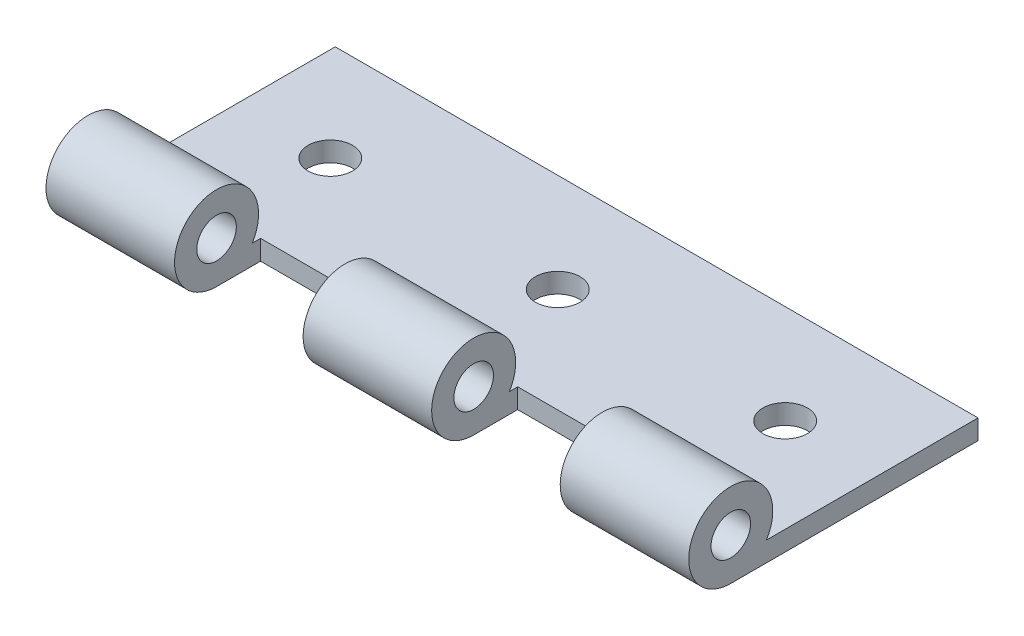
ISO-10303-21;
HEADER;
FILE_DESCRIPTION(('STEP AP214'),'2;1');
FILE_NAME('part.step','',(''),(''),'','','');
FILE_SCHEMA(('AUTOMOTIVE_DESIGN { 1 0 10303 214 1 1 1 1 }'));
ENDSEC;
DATA;
#1=APPLICATION_CONTEXT('core data for automotive mechanical design processes');
#2=APPLICATION_PROTOCOL_DEFINITION('international standard','automotive_design',2000,#1);
#3=PRODUCT_CONTEXT('',#1,'mechanical');
#4=PRODUCT('Part','Part','',(#3));
#5=PRODUCT_RELATED_PRODUCT_CATEGORY('part','',(#4));
#6=PRODUCT_DEFINITION_FORMATION('','',#4);
#7=PRODUCT_DEFINITION_CONTEXT('part definition',#1,'design');
#8=PRODUCT_DEFINITION('design','',#6,#7);
#9=PRODUCT_DEFINITION_SHAPE('','',#8);
#10=(LENGTH_UNIT() NAMED_UNIT(*) SI_UNIT(.MILLI.,.METRE.));
#11=(NAMED_UNIT(*) PLANE_ANGLE_UNIT() SI_UNIT($,.RADIAN.));
#12=(NAMED_UNIT(*) SI_UNIT($,.STERADIAN.) SOLID_ANGLE_UNIT());
#13=UNCERTAINTY_MEASURE_WITH_UNIT(LENGTH_MEASURE(1.E-05),#10,'distance_accuracy_value','');
#14=(GEOMETRIC_REPRESENTATION_CONTEXT(3) GLOBAL_UNCERTAINTY_ASSIGNED_CONTEXT((#13)) GLOBAL_UNIT_ASSIGNED_CONTEXT((#10,
#11,#12)) REPRESENTATION_CONTEXT('',''));
#15=CARTESIAN_POINT('',(0.,0.,0.));
#16=DIRECTION('',(0.,0.,1.));
#17=DIRECTION('',(1.,0.,0.));
#18=AXIS2_PLACEMENT_3D('',#15,#16,#17);
#19=CARTESIAN_POINT('',(23.,2.,0.));
#20=DIRECTION('',(0.,1.,0.));
#21=DIRECTION('',(0.,0.,1.));
#22=AXIS2_PLACEMENT_3D('',#19,#20,#21);
#23=CYLINDRICAL_SURFACE('',#22,2.25);
#24=CARTESIAN_POINT('',(23.,0.,0.));
#25=DIRECTION('',(0.,1.,0.));
#26=DIRECTION('',(0.,0.,1.));
#27=AXIS2_PLACEMENT_3D('',#24,#25,#26);
#28=CIRCLE('',#27,2.25);
#29=CARTESIAN_POINT('',(23.,0.,2.25));
#30=VERTEX_POINT('',#29);
#31=EDGE_CURVE('E225',#30,#30,#28,.T.);
#32=ORIENTED_EDGE('',*,*,#31,.F.);
#33=EDGE_LOOP('',(#32));
#34=FACE_BOUND('',#33,.T.);
#35=CARTESIAN_POINT('',(23.,2.,0.));
#36=DIRECTION('',(0.,1.,0.));
#37=DIRECTION('',(0.,0.,1.));
#38=AXIS2_PLACEMENT_3D('',#35,#36,#37);
#39=CIRCLE('',#38,2.25);
#40=CARTESIAN_POINT('',(23.,2.,2.25));
#41=VERTEX_POINT('',#40);
#42=EDGE_CURVE('E205',#41,#41,#39,.T.);
#43=ORIENTED_EDGE('',*,*,#42,.T.);
#44=EDGE_LOOP('',(#43));
#45=FACE_BOUND('',#44,.T.);
#46=ADVANCED_FACE('F17',(#34,#45),#23,.F.);
#47=CARTESIAN_POINT('',(46.,2.,0.));
#48=DIRECTION('',(0.,1.,0.));
#49=DIRECTION('',(0.,0.,1.));
#50=AXIS2_PLACEMENT_3D('',#47,#48,#49);
#51=CYLINDRICAL_SURFACE('',#50,2.25);
#52=CARTESIAN_POINT('',(46.,0.,0.));
#53=DIRECTION('',(0.,1.,0.));
#54=DIRECTION('',(0.,0.,1.));
#55=AXIS2_PLACEMENT_3D('',#52,#53,#54);
#56=CIRCLE('',#55,2.25);
#57=CARTESIAN_POINT('',(46.,0.,2.25));
#58=VERTEX_POINT('',#57);
#59=EDGE_CURVE('E333',#58,#58,#56,.T.);
#60=ORIENTED_EDGE('',*,*,#59,.F.);
#61=EDGE_LOOP('',(#60));
#62=FACE_BOUND('',#61,.T.);
#63=CARTESIAN_POINT('',(46.,2.,0.));
#64=DIRECTION('',(0.,1.,0.));
#65=DIRECTION('',(0.,0.,1.));
#66=AXIS2_PLACEMENT_3D('',#63,#64,#65);
#67=CIRCLE('',#66,2.25);
#68=CARTESIAN_POINT('',(46.,2.,2.25));
#69=VERTEX_POINT('',#68);
#70=EDGE_CURVE('E273',#69,#69,#67,.T.);
#71=ORIENTED_EDGE('',*,*,#70,.T.);
#72=EDGE_LOOP('',(#71));
#73=FACE_BOUND('',#72,.T.);
#74=ADVANCED_FACE('F19',(#62,#73),#51,.F.);
#75=CARTESIAN_POINT('',(0.,2.,0.));
#76=DIRECTION('',(0.,1.,0.));
#77=DIRECTION('',(0.,0.,1.));
#78=AXIS2_PLACEMENT_3D('',#75,#76,#77);
#79=CYLINDRICAL_SURFACE('',#78,2.25);
#80=CARTESIAN_POINT('',(0.,0.,0.));
#81=DIRECTION('',(0.,1.,0.));
#82=DIRECTION('',(0.,0.,1.));
#83=AXIS2_PLACEMENT_3D('',#80,#81,#82);
#84=CIRCLE('',#83,2.25);
#85=CARTESIAN_POINT('',(0.,0.,2.25));
#86=VERTEX_POINT('',#85);
#87=EDGE_CURVE('E336',#86,#86,#84,.T.);
#88=ORIENTED_EDGE('',*,*,#87,.F.);
#89=EDGE_LOOP('',(#88));
#90=FACE_BOUND('',#89,.T.);
#91=CARTESIAN_POINT('',(0.,2.,0.));
#92=DIRECTION('',(0.,1.,0.));
#93=DIRECTION('',(0.,0.,1.));
#94=AXIS2_PLACEMENT_3D('',#91,#92,#93);
#95=CIRCLE('',#94,2.25);
#96=CARTESIAN_POINT('',(0.,2.,2.25));
#97=VERTEX_POINT('',#96);
#98=EDGE_CURVE('E274',#97,#97,#95,.T.);
#99=ORIENTED_EDGE('',*,*,#98,.T.);
#100=EDGE_LOOP('',(#99));
#101=FACE_BOUND('',#100,.T.);
#102=ADVANCED_FACE('F572',(#90,#101),#79,.F.);
#103=CARTESIAN_POINT('',(29.5,8.5,10.55));
#104=DIRECTION('',(0.,0.,1.));
#105=DIRECTION('',(1.,0.,0.));
#106=AXIS2_PLACEMENT_3D('',#103,#104,#105);
#107=PLANE('',#106);
#108=DIRECTION('',(0.,-1.,0.));
#109=VECTOR('',#108,1.);
#110=CARTESIAN_POINT('',(29.5,8.5,10.55));
#111=LINE('',#110,#109);
#112=CARTESIAN_POINT('',(29.5,2.,10.55));
#113=VERTEX_POINT('',#112);
#114=CARTESIAN_POINT('',(29.5,0.,10.55));
#115=VERTEX_POINT('',#114);
#116=EDGE_CURVE('E11',#113,#115,#111,.T.);
#117=ORIENTED_EDGE('',*,*,#116,.T.);
#118=DIRECTION('',(-1.,0.,0.));
#119=VECTOR('',#118,1.);
#120=CARTESIAN_POINT('',(29.5,0.,10.55));
#121=LINE('',#120,#119);
#122=CARTESIAN_POINT('',(42.5,0.,10.55));
#123=VERTEX_POINT('',#122);
#124=EDGE_CURVE('E285',#123,#115,#121,.T.);
#125=ORIENTED_EDGE('',*,*,#124,.F.);
#126=DIRECTION('',(0.,-1.,0.));
#127=VECTOR('',#126,1.);
#128=CARTESIAN_POINT('',(42.5,8.5,10.55));
#129=LINE('',#128,#127);
#130=CARTESIAN_POINT('',(42.5,2.,10.55));
#131=VERTEX_POINT('',#130);
#132=EDGE_CURVE('E21',#131,#123,#129,.T.);
#133=ORIENTED_EDGE('',*,*,#132,.F.);
#134=DIRECTION('',(1.,0.,0.));
#135=VECTOR('',#134,1.);
#136=CARTESIAN_POINT('',(-9.5,2.,10.55));
#137=LINE('',#136,#135);
#138=EDGE_CURVE('E200',#113,#131,#137,.T.);
#139=ORIENTED_EDGE('',*,*,#138,.F.);
#140=EDGE_LOOP('',(#117,#125,#133,#139));
#141=FACE_BOUND('',#140,.T.);
#142=ADVANCED_FACE('F207',(#141),#107,.T.);
#143=CARTESIAN_POINT('',(29.5,8.5,19.45));
#144=DIRECTION('',(1.,0.,0.));
#145=DIRECTION('',(0.,1.,0.));
#146=AXIS2_PLACEMENT_3D('',#143,#144,#145);
#147=PLANE('',#146);
#148=CARTESIAN_POINT('',(29.5,4.25,15.));
#149=DIRECTION('',(-1.,0.,0.));
#150=DIRECTION('',(0.,0.,-1.));
#151=AXIS2_PLACEMENT_3D('',#148,#149,#150);
#152=CIRCLE('',#151,2.);
#153=CARTESIAN_POINT('',(29.5,4.25,13.));
#154=VERTEX_POINT('',#153);
#155=EDGE_CURVE('E240',#154,#154,#152,.T.);
#156=ORIENTED_EDGE('',*,*,#155,.T.);
#157=EDGE_LOOP('',(#156));
#158=FACE_BOUND('',#157,.T.);
#159=CARTESIAN_POINT('',(29.5,4.25,15.));
#160=DIRECTION('',(-1.,0.,0.));
#161=DIRECTION('',(0.,0.,-1.));
#162=AXIS2_PLACEMENT_3D('',#159,#160,#161);
#163=CIRCLE('',#162,4.25);
#164=CARTESIAN_POINT('',(29.5,0.,15.));
#165=VERTEX_POINT('',#164);
#166=CARTESIAN_POINT('',(29.5,2.,11.394448724536));
#167=VERTEX_POINT('',#166);
#168=EDGE_CURVE('E305',#165,#167,#163,.T.);
#169=ORIENTED_EDGE('',*,*,#168,.F.);
#170=DIRECTION('',(0.,0.,1.));
#171=VECTOR('',#170,1.);
#172=CARTESIAN_POINT('',(29.5,0.,19.45));
#173=LINE('',#172,#171);
#174=EDGE_CURVE('E191',#115,#165,#173,.T.);
#175=ORIENTED_EDGE('',*,*,#174,.F.);
#176=ORIENTED_EDGE('',*,*,#116,.F.);
#177=DIRECTION('',(0.,0.,-1.));
#178=VECTOR('',#177,1.);
#179=CARTESIAN_POINT('',(29.5,2.,11.394448724536));
#180=LINE('',#179,#178);
#181=EDGE_CURVE('E188',#167,#113,#180,.T.);
#182=ORIENTED_EDGE('',*,*,#181,.F.);
#183=EDGE_LOOP('',(#169,#175,#176,#182));
#184=FACE_BOUND('',#183,.T.);
#185=ADVANCED_FACE('F187',(#158,#184),#147,.T.);
#186=CARTESIAN_POINT('',(42.5,8.5,19.45));
#187=DIRECTION('',(-1.,0.,0.));
#188=DIRECTION('',(0.,0.,1.));
#189=AXIS2_PLACEMENT_3D('',#186,#187,#188);
#190=PLANE('',#189);
#191=CARTESIAN_POINT('',(42.5,4.25,15.));
#192=DIRECTION('',(1.,0.,0.));
#193=DIRECTION('',(0.,0.,1.));
#194=AXIS2_PLACEMENT_3D('',#191,#192,#193);
#195=CIRCLE('',#194,2.);
#196=CARTESIAN_POINT('',(42.5,4.25,17.));
#197=VERTEX_POINT('',#196);
#198=EDGE_CURVE('E320',#197,#197,#195,.T.);
#199=ORIENTED_EDGE('',*,*,#198,.T.);
#200=EDGE_LOOP('',(#199));
#201=FACE_BOUND('',#200,.T.);
#202=ORIENTED_EDGE('',*,*,#132,.T.);
#203=DIRECTION('',(0.,0.,-1.));
#204=VECTOR('',#203,1.);
#205=CARTESIAN_POINT('',(42.5,0.,19.45));
#206=LINE('',#205,#204);
#207=CARTESIAN_POINT('',(42.5,0.,15.));
#208=VERTEX_POINT('',#207);
#209=EDGE_CURVE('E281',#208,#123,#206,.T.);
#210=ORIENTED_EDGE('',*,*,#209,.F.);
#211=CARTESIAN_POINT('',(42.5,4.25,15.));
#212=DIRECTION('',(1.,0.,0.));
#213=DIRECTION('',(0.,0.,1.));
#214=AXIS2_PLACEMENT_3D('',#211,#212,#213);
#215=CIRCLE('',#214,4.25);
#216=CARTESIAN_POINT('',(42.5,2.,11.394448724536));
#217=VERTEX_POINT('',#216);
#218=EDGE_CURVE('E306',#217,#208,#215,.T.);
#219=ORIENTED_EDGE('',*,*,#218,.F.);
#220=DIRECTION('',(0.,0.,1.));
#221=VECTOR('',#220,1.);
#222=CARTESIAN_POINT('',(42.5,2.,11.394448724536));
#223=LINE('',#222,#221);
#224=EDGE_CURVE('E210',#131,#217,#223,.T.);
#225=ORIENTED_EDGE('',*,*,#224,.F.);
#226=EDGE_LOOP('',(#202,#210,#219,#225));
#227=FACE_BOUND('',#226,.T.);
#228=ADVANCED_FACE('F394',(#201,#227),#190,.T.);
#229=CARTESIAN_POINT('',(3.5,8.5,10.55));
#230=DIRECTION('',(0.,0.,1.));
#231=DIRECTION('',(1.,0.,0.));
#232=AXIS2_PLACEMENT_3D('',#229,#230,#231);
#233=PLANE('',#232);
#234=DIRECTION('',(0.,-1.,0.));
#235=VECTOR('',#234,1.);
#236=CARTESIAN_POINT('',(3.5,8.5,10.55));
#237=LINE('',#236,#235);
#238=CARTESIAN_POINT('',(3.5,2.,10.55));
#239=VERTEX_POINT('',#238);
#240=CARTESIAN_POINT('',(3.5,0.,10.55));
#241=VERTEX_POINT('',#240);
#242=EDGE_CURVE('E264',#239,#241,#237,.T.);
#243=ORIENTED_EDGE('',*,*,#242,.T.);
#244=DIRECTION('',(-1.,0.,0.));
#245=VECTOR('',#244,1.);
#246=CARTESIAN_POINT('',(3.5,0.,10.55));
#247=LINE('',#246,#245);
#248=CARTESIAN_POINT('',(16.5,0.,10.55));
#249=VERTEX_POINT('',#248);
#250=EDGE_CURVE('E301',#249,#241,#247,.T.);
#251=ORIENTED_EDGE('',*,*,#250,.F.);
#252=DIRECTION('',(0.,-1.,0.));
#253=VECTOR('',#252,1.);
#254=CARTESIAN_POINT('',(16.5,8.5,10.55));
#255=LINE('',#254,#253);
#256=CARTESIAN_POINT('',(16.5,2.,10.55));
#257=VERTEX_POINT('',#256);
#258=EDGE_CURVE('E267',#257,#249,#255,.T.);
#259=ORIENTED_EDGE('',*,*,#258,.F.);
#260=DIRECTION('',(1.,0.,0.));
#261=VECTOR('',#260,1.);
#262=CARTESIAN_POINT('',(-9.5,2.,10.55));
#263=LINE('',#262,#261);
#264=EDGE_CURVE('E258',#239,#257,#263,.T.);
#265=ORIENTED_EDGE('',*,*,#264,.F.);
#266=EDGE_LOOP('',(#243,#251,#259,#265));
#267=FACE_BOUND('',#266,.T.);
#268=ADVANCED_FACE('F384',(#267),#233,.T.);
#269=CARTESIAN_POINT('',(3.5,8.5,19.45));
#270=DIRECTION('',(1.,0.,0.));
#271=DIRECTION('',(0.,1.,0.));
#272=AXIS2_PLACEMENT_3D('',#269,#270,#271);
#273=PLANE('',#272);
#274=CARTESIAN_POINT('',(3.5,4.25,15.));
#275=DIRECTION('',(-1.,0.,0.));
#276=DIRECTION('',(0.,0.,-1.));
#277=AXIS2_PLACEMENT_3D('',#274,#275,#276);
#278=CIRCLE('',#277,2.);
#279=CARTESIAN_POINT('',(3.5,4.25,13.));
#280=VERTEX_POINT('',#279);
#281=EDGE_CURVE('E46',#280,#280,#278,.T.);
#282=ORIENTED_EDGE('',*,*,#281,.T.);
#283=EDGE_LOOP('',(#282));
#284=FACE_BOUND('',#283,.T.);
#285=CARTESIAN_POINT('',(3.5,4.25,15.));
#286=DIRECTION('',(-1.,0.,0.));
#287=DIRECTION('',(0.,0.,-1.));
#288=AXIS2_PLACEMENT_3D('',#285,#286,#287);
#289=CIRCLE('',#288,4.25);
#290=CARTESIAN_POINT('',(3.5,0.,15.));
#291=VERTEX_POINT('',#290);
#292=CARTESIAN_POINT('',(3.5,2.,11.394448724536));
#293=VERTEX_POINT('',#292);
#294=EDGE_CURVE('E288',#291,#293,#289,.T.);
#295=ORIENTED_EDGE('',*,*,#294,.F.);
#296=DIRECTION('',(0.,0.,1.));
#297=VECTOR('',#296,1.);
#298=CARTESIAN_POINT('',(3.5,0.,19.45));
#299=LINE('',#298,#297);
#300=EDGE_CURVE('E310',#241,#291,#299,.T.);
#301=ORIENTED_EDGE('',*,*,#300,.F.);
#302=ORIENTED_EDGE('',*,*,#242,.F.);
#303=DIRECTION('',(0.,0.,-1.));
#304=VECTOR('',#303,1.);
#305=CARTESIAN_POINT('',(3.5,2.,11.394448724536));
#306=LINE('',#305,#304);
#307=EDGE_CURVE('E251',#293,#239,#306,.T.);
#308=ORIENTED_EDGE('',*,*,#307,.F.);
#309=EDGE_LOOP('',(#295,#301,#302,#308));
#310=FACE_BOUND('',#309,.T.);
#311=ADVANCED_FACE('F381',(#284,#310),#273,.T.);
#312=CARTESIAN_POINT('',(16.5,8.5,19.45));
#313=DIRECTION('',(-1.,0.,0.));
#314=DIRECTION('',(0.,0.,1.));
#315=AXIS2_PLACEMENT_3D('',#312,#313,#314);
#316=PLANE('',#315);
#317=CARTESIAN_POINT('',(16.5,4.25,15.));
#318=DIRECTION('',(1.,0.,0.));
#319=DIRECTION('',(0.,0.,1.));
#320=AXIS2_PLACEMENT_3D('',#317,#318,#319);
#321=CIRCLE('',#320,2.);
#322=CARTESIAN_POINT('',(16.5,4.25,17.));
#323=VERTEX_POINT('',#322);
#324=EDGE_CURVE('E243',#323,#323,#321,.T.);
#325=ORIENTED_EDGE('',*,*,#324,.T.);
#326=EDGE_LOOP('',(#325));
#327=FACE_BOUND('',#326,.T.);
#328=ORIENTED_EDGE('',*,*,#258,.T.);
#329=DIRECTION('',(0.,0.,-1.));
#330=VECTOR('',#329,1.);
#331=CARTESIAN_POINT('',(16.5,0.,19.45));
#332=LINE('',#331,#330);
#333=CARTESIAN_POINT('',(16.5,0.,15.));
#334=VERTEX_POINT('',#333);
#335=EDGE_CURVE('E297',#334,#249,#332,.T.);
#336=ORIENTED_EDGE('',*,*,#335,.F.);
#337=CARTESIAN_POINT('',(16.5,4.25,15.));
#338=DIRECTION('',(1.,0.,0.));
#339=DIRECTION('',(0.,0.,1.));
#340=AXIS2_PLACEMENT_3D('',#337,#338,#339);
#341=CIRCLE('',#340,4.25);
#342=CARTESIAN_POINT('',(16.5,2.,11.394448724536));
#343=VERTEX_POINT('',#342);
#344=EDGE_CURVE('E343',#343,#334,#341,.T.);
#345=ORIENTED_EDGE('',*,*,#344,.F.);
#346=DIRECTION('',(0.,0.,1.));
#347=VECTOR('',#346,1.);
#348=CARTESIAN_POINT('',(16.5,2.,11.394448724536));
#349=LINE('',#348,#347);
#350=EDGE_CURVE('E247',#257,#343,#349,.T.);
#351=ORIENTED_EDGE('',*,*,#350,.F.);
#352=EDGE_LOOP('',(#328,#336,#345,#351));
#353=FACE_BOUND('',#352,.T.);
#354=ADVANCED_FACE('F388',(#327,#353),#316,.T.);
#355=CARTESIAN_POINT('',(55.5,4.25,15.));
#356=DIRECTION('',(-1.,0.,0.));
#357=DIRECTION('',(0.,0.,1.));
#358=AXIS2_PLACEMENT_3D('',#355,#356,#357);
#359=PLANE('',#358);
#360=CARTESIAN_POINT('',(55.5,4.25,15.));
#361=DIRECTION('',(1.,0.,0.));
#362=DIRECTION('',(0.,0.,1.));
#363=AXIS2_PLACEMENT_3D('',#360,#361,#362);
#364=CIRCLE('',#363,2.);
#365=CARTESIAN_POINT('',(55.5,4.25,17.));
#366=VERTEX_POINT('',#365);
#367=EDGE_CURVE('E244',#366,#366,#364,.T.);
#368=ORIENTED_EDGE('',*,*,#367,.F.);
#369=EDGE_LOOP('',(#368));
#370=FACE_BOUND('',#369,.T.);
#371=DIRECTION('',(0.,0.,1.));
#372=VECTOR('',#371,1.);
#373=CARTESIAN_POINT('',(55.5,2.,11.394448724536));
#374=LINE('',#373,#372);
#375=CARTESIAN_POINT('',(55.5,2.,-10.));
#376=VERTEX_POINT('',#375);
#377=CARTESIAN_POINT('',(55.5,2.,11.394448724536));
#378=VERTEX_POINT('',#377);
#379=EDGE_CURVE('E235',#376,#378,#374,.T.);
#380=ORIENTED_EDGE('',*,*,#379,.T.);
#381=CARTESIAN_POINT('',(55.5,4.25,15.));
#382=DIRECTION('',(1.,0.,0.));
#383=DIRECTION('',(0.,0.,1.));
#384=AXIS2_PLACEMENT_3D('',#381,#382,#383);
#385=CIRCLE('',#384,4.25);
#386=CARTESIAN_POINT('',(55.5,0.,15.));
#387=VERTEX_POINT('',#386);
#388=EDGE_CURVE('E302',#378,#387,#385,.T.);
#389=ORIENTED_EDGE('',*,*,#388,.T.);
#390=DIRECTION('',(0.,0.,-1.));
#391=VECTOR('',#390,1.);
#392=CARTESIAN_POINT('',(55.5,0.,-10.));
#393=LINE('',#392,#391);
#394=CARTESIAN_POINT('',(55.5,0.,-10.));
#395=VERTEX_POINT('',#394);
#396=EDGE_CURVE('E221',#387,#395,#393,.T.);
#397=ORIENTED_EDGE('',*,*,#396,.T.);
#398=DIRECTION('',(0.,1.,0.));
#399=VECTOR('',#398,1.);
#400=CARTESIAN_POINT('',(55.5,2.,-10.));
#401=LINE('',#400,#399);
#402=EDGE_CURVE('E352',#395,#376,#401,.T.);
#403=ORIENTED_EDGE('',*,*,#402,.T.);
#404=EDGE_LOOP('',(#380,#389,#397,#403));
#405=FACE_BOUND('',#404,.T.);
#406=ADVANCED_FACE('F369',(#370,#405),#359,.F.);
#407=CARTESIAN_POINT('',(-9.5,4.25,15.));
#408=DIRECTION('',(-1.,0.,0.));
#409=DIRECTION('',(0.,0.,1.));
#410=AXIS2_PLACEMENT_3D('',#407,#408,#409);
#411=PLANE('',#410);
#412=CARTESIAN_POINT('',(-9.5,4.25,15.));
#413=DIRECTION('',(1.,0.,0.));
#414=DIRECTION('',(0.,0.,1.));
#415=AXIS2_PLACEMENT_3D('',#412,#413,#414);
#416=CIRCLE('',#415,2.);
#417=CARTESIAN_POINT('',(-9.5,4.25,17.));
#418=VERTEX_POINT('',#417);
#419=EDGE_CURVE('E38',#418,#418,#416,.T.);
#420=ORIENTED_EDGE('',*,*,#419,.T.);
#421=EDGE_LOOP('',(#420));
#422=FACE_BOUND('',#421,.T.);
#423=DIRECTION('',(0.,0.,1.));
#424=VECTOR('',#423,1.);
#425=CARTESIAN_POINT('',(-9.5,2.,11.394448724536));
#426=LINE('',#425,#424);
#427=CARTESIAN_POINT('',(-9.5,2.,-10.));
#428=VERTEX_POINT('',#427);
#429=CARTESIAN_POINT('',(-9.5,2.,11.394448724536));
#430=VERTEX_POINT('',#429);
#431=EDGE_CURVE('E227',#428,#430,#426,.T.);
#432=ORIENTED_EDGE('',*,*,#431,.F.);
#433=DIRECTION('',(0.,1.,0.));
#434=VECTOR('',#433,1.);
#435=CARTESIAN_POINT('',(-9.5,2.,-10.));
#436=LINE('',#435,#434);
#437=CARTESIAN_POINT('',(-9.5,0.,-10.));
#438=VERTEX_POINT('',#437);
#439=EDGE_CURVE('E270',#438,#428,#436,.T.);
#440=ORIENTED_EDGE('',*,*,#439,.F.);
#441=DIRECTION('',(0.,0.,-1.));
#442=VECTOR('',#441,1.);
#443=CARTESIAN_POINT('',(-9.5,0.,-10.));
#444=LINE('',#443,#442);
#445=CARTESIAN_POINT('',(-9.5,0.,15.));
#446=VERTEX_POINT('',#445);
#447=EDGE_CURVE('E324',#446,#438,#444,.T.);
#448=ORIENTED_EDGE('',*,*,#447,.F.);
#449=CARTESIAN_POINT('',(-9.5,4.25,15.));
#450=DIRECTION('',(1.,0.,0.));
#451=DIRECTION('',(0.,0.,1.));
#452=AXIS2_PLACEMENT_3D('',#449,#450,#451);
#453=CIRCLE('',#452,4.25);
#454=EDGE_CURVE('E315',#430,#446,#453,.T.);
#455=ORIENTED_EDGE('',*,*,#454,.F.);
#456=EDGE_LOOP('',(#432,#440,#448,#455));
#457=FACE_BOUND('',#456,.T.);
#458=ADVANCED_FACE('F365',(#422,#457),#411,.T.);
#459=CARTESIAN_POINT('',(-9.5,2.,-10.));
#460=DIRECTION('',(0.,0.,-1.));
#461=DIRECTION('',(0.,-1.,0.));
#462=AXIS2_PLACEMENT_3D('',#459,#460,#461);
#463=PLANE('',#462);
#464=DIRECTION('',(1.,0.,0.));
#465=VECTOR('',#464,1.);
#466=CARTESIAN_POINT('',(-9.5,2.,-10.));
#467=LINE('',#466,#465);
#468=EDGE_CURVE('E232',#428,#376,#467,.T.);
#469=ORIENTED_EDGE('',*,*,#468,.T.);
#470=ORIENTED_EDGE('',*,*,#402,.F.);
#471=DIRECTION('',(1.,0.,0.));
#472=VECTOR('',#471,1.);
#473=CARTESIAN_POINT('',(-9.5,0.,-10.));
#474=LINE('',#473,#472);
#475=EDGE_CURVE('E226',#438,#395,#474,.T.);
#476=ORIENTED_EDGE('',*,*,#475,.F.);
#477=ORIENTED_EDGE('',*,*,#439,.T.);
#478=EDGE_LOOP('',(#469,#470,#476,#477));
#479=FACE_BOUND('',#478,.T.);
#480=ADVANCED_FACE('F360',(#479),#463,.T.);
#481=CARTESIAN_POINT('',(-9.5,4.25,15.));
#482=DIRECTION('',(1.,0.,0.));
#483=DIRECTION('',(0.,0.,-1.));
#484=AXIS2_PLACEMENT_3D('',#481,#482,#483);
#485=CYLINDRICAL_SURFACE('',#484,2.);
#486=ORIENTED_EDGE('',*,*,#419,.F.);
#487=EDGE_LOOP('',(#486));
#488=FACE_BOUND('',#487,.T.);
#489=ORIENTED_EDGE('',*,*,#281,.F.);
#490=EDGE_LOOP('',(#489));
#491=FACE_BOUND('',#490,.T.);
#492=ADVANCED_FACE('F592',(#488,#491),#485,.F.);
#493=CARTESIAN_POINT('',(-9.5,4.25,15.));
#494=DIRECTION('',(1.,0.,0.));
#495=DIRECTION('',(0.,0.,-1.));
#496=AXIS2_PLACEMENT_3D('',#493,#494,#495);
#497=CYLINDRICAL_SURFACE('',#496,4.25);
#498=DIRECTION('',(1.,0.,0.));
#499=VECTOR('',#498,1.);
#500=CARTESIAN_POINT('',(-9.5,0.,15.));
#501=LINE('',#500,#499);
#502=EDGE_CURVE('E314',#446,#291,#501,.T.);
#503=ORIENTED_EDGE('',*,*,#502,.T.);
#504=ORIENTED_EDGE('',*,*,#294,.T.);
#505=DIRECTION('',(1.,0.,0.));
#506=VECTOR('',#505,1.);
#507=CARTESIAN_POINT('',(-9.5,2.,11.394448724536));
#508=LINE('',#507,#506);
#509=EDGE_CURVE('E231',#430,#293,#508,.T.);
#510=ORIENTED_EDGE('',*,*,#509,.F.);
#511=ORIENTED_EDGE('',*,*,#454,.T.);
#512=EDGE_LOOP('',(#503,#504,#510,#511));
#513=FACE_BOUND('',#512,.T.);
#514=ADVANCED_FACE('F377',(#513),#497,.T.);
#515=CARTESIAN_POINT('',(-9.5,4.25,15.));
#516=DIRECTION('',(1.,0.,0.));
#517=DIRECTION('',(0.,0.,-1.));
#518=AXIS2_PLACEMENT_3D('',#515,#516,#517);
#519=CYLINDRICAL_SURFACE('',#518,2.);
#520=ORIENTED_EDGE('',*,*,#324,.F.);
#521=EDGE_LOOP('',(#520));
#522=FACE_BOUND('',#521,.T.);
#523=ORIENTED_EDGE('',*,*,#155,.F.);
#524=EDGE_LOOP('',(#523));
#525=FACE_BOUND('',#524,.T.);
#526=ADVANCED_FACE('F622',(#522,#525),#519,.F.);
#527=CARTESIAN_POINT('',(-9.5,4.25,15.));
#528=DIRECTION('',(1.,0.,0.));
#529=DIRECTION('',(0.,0.,-1.));
#530=AXIS2_PLACEMENT_3D('',#527,#528,#529);
#531=CYLINDRICAL_SURFACE('',#530,2.);
#532=ORIENTED_EDGE('',*,*,#367,.T.);
#533=EDGE_LOOP('',(#532));
#534=FACE_BOUND('',#533,.T.);
#535=ORIENTED_EDGE('',*,*,#198,.F.);
#536=EDGE_LOOP('',(#535));
#537=FACE_BOUND('',#536,.T.);
#538=ADVANCED_FACE('F626',(#534,#537),#531,.F.);
#539=CARTESIAN_POINT('',(-9.5,4.25,15.));
#540=DIRECTION('',(1.,0.,0.));
#541=DIRECTION('',(0.,0.,-1.));
#542=AXIS2_PLACEMENT_3D('',#539,#540,#541);
#543=CYLINDRICAL_SURFACE('',#542,4.25);
#544=DIRECTION('',(1.,0.,0.));
#545=VECTOR('',#544,1.);
#546=CARTESIAN_POINT('',(-9.5,0.,15.));
#547=LINE('',#546,#545);
#548=EDGE_CURVE('E293',#334,#165,#547,.T.);
#549=ORIENTED_EDGE('',*,*,#548,.T.);
#550=ORIENTED_EDGE('',*,*,#168,.T.);
#551=DIRECTION('',(1.,0.,0.));
#552=VECTOR('',#551,1.);
#553=CARTESIAN_POINT('',(-9.5,2.,11.394448724536));
#554=LINE('',#553,#552);
#555=EDGE_CURVE('E203',#343,#167,#554,.T.);
#556=ORIENTED_EDGE('',*,*,#555,.F.);
#557=ORIENTED_EDGE('',*,*,#344,.T.);
#558=EDGE_LOOP('',(#549,#550,#556,#557));
#559=FACE_BOUND('',#558,.T.);
#560=ADVANCED_FACE('F391',(#559),#543,.T.);
#561=CARTESIAN_POINT('',(-9.5,4.25,15.));
#562=DIRECTION('',(1.,0.,0.));
#563=DIRECTION('',(0.,0.,-1.));
#564=AXIS2_PLACEMENT_3D('',#561,#562,#563);
#565=CYLINDRICAL_SURFACE('',#564,4.25);
#566=DIRECTION('',(1.,0.,0.));
#567=VECTOR('',#566,1.);
#568=CARTESIAN_POINT('',(-9.5,2.,11.394448724536));
#569=LINE('',#568,#567);
#570=EDGE_CURVE('E216',#217,#378,#569,.T.);
#571=ORIENTED_EDGE('',*,*,#570,.F.);
#572=ORIENTED_EDGE('',*,*,#218,.T.);
#573=DIRECTION('',(1.,0.,0.));
#574=VECTOR('',#573,1.);
#575=CARTESIAN_POINT('',(-9.5,0.,15.));
#576=LINE('',#575,#574);
#577=EDGE_CURVE('E277',#208,#387,#576,.T.);
#578=ORIENTED_EDGE('',*,*,#577,.T.);
#579=ORIENTED_EDGE('',*,*,#388,.F.);
#580=EDGE_LOOP('',(#571,#572,#578,#579));
#581=FACE_BOUND('',#580,.T.);
#582=ADVANCED_FACE('F600',(#581),#565,.T.);
#583=CARTESIAN_POINT('',(-9.5,0.,-10.));
#584=DIRECTION('',(0.,-1.,0.));
#585=DIRECTION('',(0.,0.,-1.));
#586=AXIS2_PLACEMENT_3D('',#583,#584,#585);
#587=PLANE('',#586);
#588=ORIENTED_EDGE('',*,*,#87,.T.);
#589=EDGE_LOOP('',(#588));
#590=FACE_BOUND('',#589,.T.);
#591=ORIENTED_EDGE('',*,*,#59,.T.);
#592=EDGE_LOOP('',(#591));
#593=FACE_BOUND('',#592,.T.);
#594=ORIENTED_EDGE('',*,*,#31,.T.);
#595=EDGE_LOOP('',(#594));
#596=FACE_BOUND('',#595,.T.);
#597=ORIENTED_EDGE('',*,*,#577,.F.);
#598=ORIENTED_EDGE('',*,*,#209,.T.);
#599=ORIENTED_EDGE('',*,*,#124,.T.);
#600=ORIENTED_EDGE('',*,*,#174,.T.);
#601=ORIENTED_EDGE('',*,*,#548,.F.);
#602=ORIENTED_EDGE('',*,*,#335,.T.);
#603=ORIENTED_EDGE('',*,*,#250,.T.);
#604=ORIENTED_EDGE('',*,*,#300,.T.);
#605=ORIENTED_EDGE('',*,*,#502,.F.);
#606=ORIENTED_EDGE('',*,*,#447,.T.);
#607=ORIENTED_EDGE('',*,*,#475,.T.);
#608=ORIENTED_EDGE('',*,*,#396,.F.);
#609=EDGE_LOOP('',(#597,#598,#599,#600,#601,#602,#603,#604,#605,#606,#607,#608));
#610=FACE_BOUND('',#609,.T.);
#611=ADVANCED_FACE('F373',(#590,#593,#596,#610),#587,.T.);
#612=CARTESIAN_POINT('',(-9.5,2.,11.394448724536));
#613=DIRECTION('',(0.,1.,0.));
#614=DIRECTION('',(0.,0.,-1.));
#615=AXIS2_PLACEMENT_3D('',#612,#613,#614);
#616=PLANE('',#615);
#617=ORIENTED_EDGE('',*,*,#98,.F.);
#618=EDGE_LOOP('',(#617));
#619=FACE_BOUND('',#618,.T.);
#620=ORIENTED_EDGE('',*,*,#70,.F.);
#621=EDGE_LOOP('',(#620));
#622=FACE_BOUND('',#621,.T.);
#623=ORIENTED_EDGE('',*,*,#42,.F.);
#624=EDGE_LOOP('',(#623));
#625=FACE_BOUND('',#624,.T.);
#626=ORIENTED_EDGE('',*,*,#138,.T.);
#627=ORIENTED_EDGE('',*,*,#224,.T.);
#628=ORIENTED_EDGE('',*,*,#570,.T.);
#629=ORIENTED_EDGE('',*,*,#379,.F.);
#630=ORIENTED_EDGE('',*,*,#468,.F.);
#631=ORIENTED_EDGE('',*,*,#431,.T.);
#632=ORIENTED_EDGE('',*,*,#509,.T.);
#633=ORIENTED_EDGE('',*,*,#307,.T.);
#634=ORIENTED_EDGE('',*,*,#264,.T.);
#635=ORIENTED_EDGE('',*,*,#350,.T.);
#636=ORIENTED_EDGE('',*,*,#555,.T.);
#637=ORIENTED_EDGE('',*,*,#181,.T.);
#638=EDGE_LOOP('',(#626,#627,#628,#629,#630,#631,#632,#633,#634,#635,#636,#637));
#639=FACE_BOUND('',#638,.T.);
#640=ADVANCED_FACE('F198',(#619,#622,#625,#639),#616,.T.);
#641=CLOSED_SHELL('',(#46,#74,#102,#142,#185,#228,#268,#311,#354,#406,#458,#480,#492,#514,#526,
#538,#560,#582,#611,#640));
#642=MANIFOLD_SOLID_BREP('B1',#641);
#643=ADVANCED_BREP_SHAPE_REPRESENTATION('',(#18,#642),#14);
#644=SHAPE_DEFINITION_REPRESENTATION(#9,#643);
ENDSEC;
END-ISO-10303-21;
